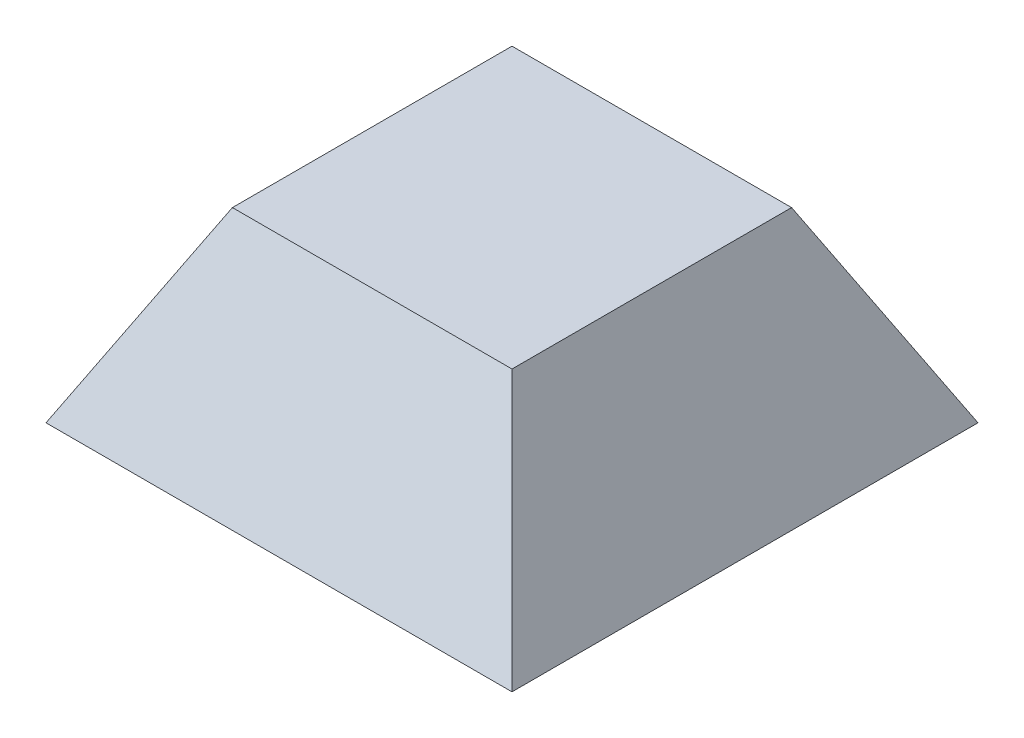
ISO-10303-21;
HEADER;
FILE_DESCRIPTION(('STEP AP214'),'2;1');
FILE_NAME('part.step','',(''),(''),'','','');
FILE_SCHEMA(('AUTOMOTIVE_DESIGN { 1 0 10303 214 1 1 1 1 }'));
ENDSEC;
DATA;
#1=APPLICATION_CONTEXT('core data for automotive mechanical design processes');
#2=APPLICATION_PROTOCOL_DEFINITION('international standard','automotive_design',2000,#1);
#3=PRODUCT_CONTEXT('',#1,'mechanical');
#4=PRODUCT('Part','Part','',(#3));
#5=PRODUCT_RELATED_PRODUCT_CATEGORY('part','',(#4));
#6=PRODUCT_DEFINITION_FORMATION('','',#4);
#7=PRODUCT_DEFINITION_CONTEXT('part definition',#1,'design');
#8=PRODUCT_DEFINITION('design','',#6,#7);
#9=PRODUCT_DEFINITION_SHAPE('','',#8);
#10=(LENGTH_UNIT() NAMED_UNIT(*) SI_UNIT(.MILLI.,.METRE.));
#11=(NAMED_UNIT(*) PLANE_ANGLE_UNIT() SI_UNIT($,.RADIAN.));
#12=(NAMED_UNIT(*) SI_UNIT($,.STERADIAN.) SOLID_ANGLE_UNIT());
#13=UNCERTAINTY_MEASURE_WITH_UNIT(LENGTH_MEASURE(1.E-05),#10,'distance_accuracy_value','');
#14=(GEOMETRIC_REPRESENTATION_CONTEXT(3) GLOBAL_UNCERTAINTY_ASSIGNED_CONTEXT((#13)) GLOBAL_UNIT_ASSIGNED_CONTEXT((#10,
#11,#12)) REPRESENTATION_CONTEXT('',''));
#15=CARTESIAN_POINT('',(0.,0.,0.));
#16=DIRECTION('',(0.,0.,1.));
#17=DIRECTION('',(1.,0.,0.));
#18=AXIS2_PLACEMENT_3D('',#15,#16,#17);
#19=CARTESIAN_POINT('',(0.,40.,0.));
#20=DIRECTION('',(0.,1.,0.));
#21=DIRECTION('',(0.,0.,1.));
#22=AXIS2_PLACEMENT_3D('',#19,#20,#21);
#23=PLANE('',#22);
#24=DIRECTION('',(0.,0.,-1.));
#25=VECTOR('',#24,1.);
#26=CARTESIAN_POINT('',(30.,40.,-30.));
#27=LINE('',#26,#25);
#28=CARTESIAN_POINT('',(30.,40.,30.));
#29=VERTEX_POINT('',#28);
#30=CARTESIAN_POINT('',(30.,40.,-30.));
#31=VERTEX_POINT('',#30);
#32=EDGE_CURVE('E119',#29,#31,#27,.T.);
#33=ORIENTED_EDGE('',*,*,#32,.T.);
#34=DIRECTION('',(-1.,0.,0.));
#35=VECTOR('',#34,1.);
#36=CARTESIAN_POINT('',(-30.,40.,-30.));
#37=LINE('',#36,#35);
#38=CARTESIAN_POINT('',(-30.,40.,-30.));
#39=VERTEX_POINT('',#38);
#40=EDGE_CURVE('E12',#31,#39,#37,.T.);
#41=ORIENTED_EDGE('',*,*,#40,.T.);
#42=DIRECTION('',(0.,0.,1.));
#43=VECTOR('',#42,1.);
#44=CARTESIAN_POINT('',(-30.,40.,-30.));
#45=LINE('',#44,#43);
#46=CARTESIAN_POINT('',(-30.,40.,30.));
#47=VERTEX_POINT('',#46);
#48=EDGE_CURVE('E56',#39,#47,#45,.T.);
#49=ORIENTED_EDGE('',*,*,#48,.T.);
#50=DIRECTION('',(1.,0.,0.));
#51=VECTOR('',#50,1.);
#52=CARTESIAN_POINT('',(-30.,40.,30.));
#53=LINE('',#52,#51);
#54=EDGE_CURVE('E121',#47,#29,#53,.T.);
#55=ORIENTED_EDGE('',*,*,#54,.T.);
#56=EDGE_LOOP('',(#33,#41,#49,#55));
#57=FACE_BOUND('',#56,.T.);
#58=ADVANCED_FACE('F46',(#57),#23,.T.);
#59=CARTESIAN_POINT('',(0.,0.,0.));
#60=DIRECTION('',(0.,-1.,0.));
#61=DIRECTION('',(0.,0.,-1.));
#62=AXIS2_PLACEMENT_3D('',#59,#60,#61);
#63=PLANE('',#62);
#64=DIRECTION('',(0.,0.,-1.));
#65=VECTOR('',#64,1.);
#66=CARTESIAN_POINT('',(50.,0.,50.));
#67=LINE('',#66,#65);
#68=CARTESIAN_POINT('',(50.,0.,50.));
#69=VERTEX_POINT('',#68);
#70=CARTESIAN_POINT('',(50.,0.,-50.));
#71=VERTEX_POINT('',#70);
#72=EDGE_CURVE('E113',#69,#71,#67,.T.);
#73=ORIENTED_EDGE('',*,*,#72,.F.);
#74=DIRECTION('',(1.,0.,0.));
#75=VECTOR('',#74,1.);
#76=CARTESIAN_POINT('',(-50.,0.,50.));
#77=LINE('',#76,#75);
#78=CARTESIAN_POINT('',(-50.,0.,50.));
#79=VERTEX_POINT('',#78);
#80=EDGE_CURVE('E98',#79,#69,#77,.T.);
#81=ORIENTED_EDGE('',*,*,#80,.F.);
#82=DIRECTION('',(0.,0.,1.));
#83=VECTOR('',#82,1.);
#84=CARTESIAN_POINT('',(-50.,0.,50.));
#85=LINE('',#84,#83);
#86=CARTESIAN_POINT('',(-50.,0.,-50.));
#87=VERTEX_POINT('',#86);
#88=EDGE_CURVE('E90',#87,#79,#85,.T.);
#89=ORIENTED_EDGE('',*,*,#88,.F.);
#90=DIRECTION('',(-1.,0.,0.));
#91=VECTOR('',#90,1.);
#92=CARTESIAN_POINT('',(-50.,0.,-50.));
#93=LINE('',#92,#91);
#94=EDGE_CURVE('E95',#71,#87,#93,.T.);
#95=ORIENTED_EDGE('',*,*,#94,.F.);
#96=EDGE_LOOP('',(#73,#81,#89,#95));
#97=FACE_BOUND('',#96,.T.);
#98=ADVANCED_FACE('F94',(#97),#63,.T.);
#99=CARTESIAN_POINT('',(0.,20.,40.));
#100=DIRECTION('',(0.,-0.447213595499958,-0.894427190999916));
#101=DIRECTION('',(0.,0.894427190999916,-0.447213595499958));
#102=AXIS2_PLACEMENT_3D('',#99,#100,#101);
#103=PLANE('',#102);
#104=DIRECTION('',(-0.408248290463863,0.816496580927726,-0.408248290463863));
#105=VECTOR('',#104,1.);
#106=CARTESIAN_POINT('',(50.,0.,50.));
#107=LINE('',#106,#105);
#108=EDGE_CURVE('E184',#69,#29,#107,.T.);
#109=ORIENTED_EDGE('',*,*,#108,.T.);
#110=ORIENTED_EDGE('',*,*,#54,.F.);
#111=DIRECTION('',(0.408248290463863,0.816496580927726,-0.408248290463863));
#112=VECTOR('',#111,1.);
#113=CARTESIAN_POINT('',(-50.,0.,50.));
#114=LINE('',#113,#112);
#115=EDGE_CURVE('E123',#79,#47,#114,.T.);
#116=ORIENTED_EDGE('',*,*,#115,.F.);
#117=ORIENTED_EDGE('',*,*,#80,.T.);
#118=EDGE_LOOP('',(#109,#110,#116,#117));
#119=FACE_BOUND('',#118,.T.);
#120=ADVANCED_FACE('F145',(#119),#103,.F.);
#121=CARTESIAN_POINT('',(-40.,20.,0.));
#122=DIRECTION('',(0.894427190999916,-0.447213595499958,0.));
#123=DIRECTION('',(0.447213595499958,0.894427190999916,0.));
#124=AXIS2_PLACEMENT_3D('',#121,#122,#123);
#125=PLANE('',#124);
#126=ORIENTED_EDGE('',*,*,#115,.T.);
#127=ORIENTED_EDGE('',*,*,#48,.F.);
#128=DIRECTION('',(0.408248290463863,0.816496580927726,0.408248290463863));
#129=VECTOR('',#128,1.);
#130=CARTESIAN_POINT('',(-50.,0.,-50.));
#131=LINE('',#130,#129);
#132=EDGE_CURVE('E112',#87,#39,#131,.T.);
#133=ORIENTED_EDGE('',*,*,#132,.F.);
#134=ORIENTED_EDGE('',*,*,#88,.T.);
#135=EDGE_LOOP('',(#126,#127,#133,#134));
#136=FACE_BOUND('',#135,.T.);
#137=ADVANCED_FACE('F117',(#136),#125,.F.);
#138=CARTESIAN_POINT('',(40.,20.,0.));
#139=DIRECTION('',(-0.894427190999916,-0.447213595499958,0.));
#140=DIRECTION('',(0.447213595499958,-0.894427190999916,0.));
#141=AXIS2_PLACEMENT_3D('',#138,#139,#140);
#142=PLANE('',#141);
#143=DIRECTION('',(-0.408248290463863,0.816496580927726,0.408248290463863));
#144=VECTOR('',#143,1.);
#145=CARTESIAN_POINT('',(50.,0.,-50.));
#146=LINE('',#145,#144);
#147=EDGE_CURVE('E64',#71,#31,#146,.T.);
#148=ORIENTED_EDGE('',*,*,#147,.T.);
#149=ORIENTED_EDGE('',*,*,#32,.F.);
#150=ORIENTED_EDGE('',*,*,#108,.F.);
#151=ORIENTED_EDGE('',*,*,#72,.T.);
#152=EDGE_LOOP('',(#148,#149,#150,#151));
#153=FACE_BOUND('',#152,.T.);
#154=ADVANCED_FACE('F144',(#153),#142,.F.);
#155=CARTESIAN_POINT('',(0.,20.,-40.));
#156=DIRECTION('',(0.,-0.447213595499958,0.894427190999916));
#157=DIRECTION('',(0.,-0.894427190999916,-0.447213595499958));
#158=AXIS2_PLACEMENT_3D('',#155,#156,#157);
#159=PLANE('',#158);
#160=ORIENTED_EDGE('',*,*,#132,.T.);
#161=ORIENTED_EDGE('',*,*,#40,.F.);
#162=ORIENTED_EDGE('',*,*,#147,.F.);
#163=ORIENTED_EDGE('',*,*,#94,.T.);
#164=EDGE_LOOP('',(#160,#161,#162,#163));
#165=FACE_BOUND('',#164,.T.);
#166=ADVANCED_FACE('F111',(#165),#159,.F.);
#167=CLOSED_SHELL('',(#58,#98,#120,#137,#154,#166));
#168=MANIFOLD_SOLID_BREP('B2',#167);
#169=ADVANCED_BREP_SHAPE_REPRESENTATION('',(#18,#168),#14);
#170=SHAPE_DEFINITION_REPRESENTATION(#9,#169);
ENDSEC;
END-ISO-10303-21;
